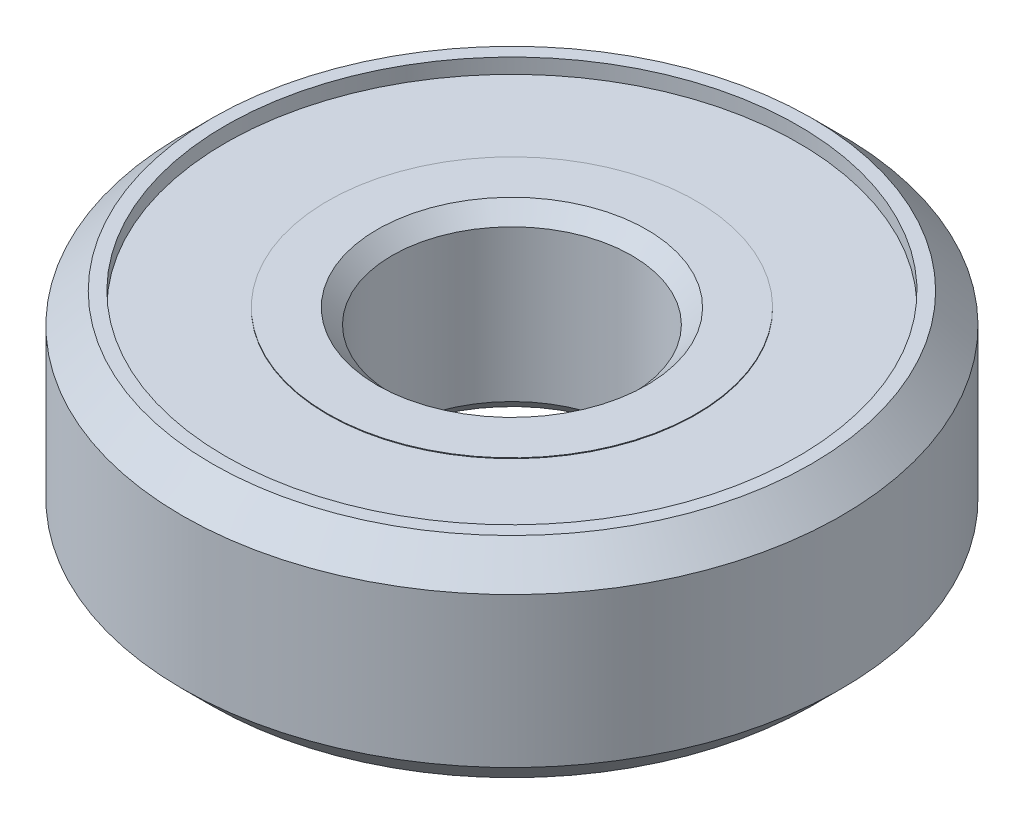
ISO-10303-21;
HEADER;
FILE_DESCRIPTION(('STEP AP214'),'2;1');
FILE_NAME('part.step','',(''),(''),'','','');
FILE_SCHEMA(('AUTOMOTIVE_DESIGN { 1 0 10303 214 1 1 1 1 }'));
ENDSEC;
DATA;
#1=APPLICATION_CONTEXT('core data for automotive mechanical design processes');
#2=APPLICATION_PROTOCOL_DEFINITION('international standard','automotive_design',2000,#1);
#3=PRODUCT_CONTEXT('',#1,'mechanical');
#4=PRODUCT('Part','Part','',(#3));
#5=PRODUCT_RELATED_PRODUCT_CATEGORY('part','',(#4));
#6=PRODUCT_DEFINITION_FORMATION('','',#4);
#7=PRODUCT_DEFINITION_CONTEXT('part definition',#1,'design');
#8=PRODUCT_DEFINITION('design','',#6,#7);
#9=PRODUCT_DEFINITION_SHAPE('','',#8);
#10=(LENGTH_UNIT() NAMED_UNIT(*) SI_UNIT(.MILLI.,.METRE.));
#11=(NAMED_UNIT(*) PLANE_ANGLE_UNIT() SI_UNIT($,.RADIAN.));
#12=(NAMED_UNIT(*) SI_UNIT($,.STERADIAN.) SOLID_ANGLE_UNIT());
#13=UNCERTAINTY_MEASURE_WITH_UNIT(LENGTH_MEASURE(1.E-05),#10,'distance_accuracy_value','');
#14=(GEOMETRIC_REPRESENTATION_CONTEXT(3) GLOBAL_UNCERTAINTY_ASSIGNED_CONTEXT((#13)) GLOBAL_UNIT_ASSIGNED_CONTEXT((#10,
#11,#12)) REPRESENTATION_CONTEXT('',''));
#15=CARTESIAN_POINT('',(0.,0.,0.));
#16=DIRECTION('',(0.,0.,1.));
#17=DIRECTION('',(1.,0.,0.));
#18=AXIS2_PLACEMENT_3D('',#15,#16,#17);
#19=CARTESIAN_POINT('',(0.,7.,0.));
#20=DIRECTION('',(0.,-1.,0.));
#21=DIRECTION('',(0.,0.,-1.));
#22=AXIS2_PLACEMENT_3D('',#19,#20,#21);
#23=CYLINDRICAL_SURFACE('',#22,4.);
#24=CARTESIAN_POINT('',(0.,0.975000224000002,0.));
#25=DIRECTION('',(0.,-1.,0.));
#26=DIRECTION('',(0.,0.,-1.));
#27=AXIS2_PLACEMENT_3D('',#24,#25,#26);
#28=CIRCLE('',#27,4.);
#29=CARTESIAN_POINT('',(0.,0.975000224000002,-4.));
#30=VERTEX_POINT('',#29);
#31=EDGE_CURVE('E10',#30,#30,#28,.T.);
#32=ORIENTED_EDGE('',*,*,#31,.T.);
#33=EDGE_LOOP('',(#32));
#34=FACE_BOUND('',#33,.T.);
#35=CARTESIAN_POINT('',(0.,6.02500000000001,0.));
#36=DIRECTION('',(0.,1.,0.));
#37=DIRECTION('',(0.,0.,1.));
#38=AXIS2_PLACEMENT_3D('',#35,#36,#37);
#39=CIRCLE('',#38,4.);
#40=CARTESIAN_POINT('',(0.,6.02500000000001,4.));
#41=VERTEX_POINT('',#40);
#42=EDGE_CURVE('E53',#41,#41,#39,.T.);
#43=ORIENTED_EDGE('',*,*,#42,.T.);
#44=EDGE_LOOP('',(#43));
#45=FACE_BOUND('',#44,.T.);
#46=ADVANCED_FACE('F33',(#34,#45),#23,.F.);
#47=CARTESIAN_POINT('',(0.,0.,0.));
#48=DIRECTION('',(0.,1.,0.));
#49=DIRECTION('',(0.,0.,1.));
#50=AXIS2_PLACEMENT_3D('',#47,#48,#49);
#51=PLANE('',#50);
#52=CARTESIAN_POINT('',(0.,0.,0.));
#53=DIRECTION('',(0.,1.,0.));
#54=DIRECTION('',(0.,0.,1.));
#55=AXIS2_PLACEMENT_3D('',#52,#53,#54);
#56=CIRCLE('',#55,10.);
#57=CARTESIAN_POINT('',(0.,0.,10.));
#58=VERTEX_POINT('',#57);
#59=EDGE_CURVE('E56',#58,#58,#56,.F.);
#60=ORIENTED_EDGE('',*,*,#59,.T.);
#61=EDGE_LOOP('',(#60));
#62=FACE_BOUND('',#61,.T.);
#63=CARTESIAN_POINT('',(0.,2.2399999910494E-07,0.));
#64=DIRECTION('',(0.,1.,0.));
#65=DIRECTION('',(0.,0.,1.));
#66=AXIS2_PLACEMENT_3D('',#63,#64,#65);
#67=CIRCLE('',#66,9.56049987692541);
#68=CARTESIAN_POINT('',(0.,2.2399999910494E-07,9.56049987692541));
#69=VERTEX_POINT('',#68);
#70=EDGE_CURVE('E81',#69,#69,#67,.T.);
#71=ORIENTED_EDGE('',*,*,#70,.T.);
#72=EDGE_LOOP('',(#71));
#73=FACE_BOUND('',#72,.T.);
#74=ADVANCED_FACE('F104',(#62,#73),#51,.F.);
#75=CARTESIAN_POINT('',(0.,6.5,0.));
#76=DIRECTION('',(0.,1.,0.));
#77=DIRECTION('',(0.,0.,1.));
#78=AXIS2_PLACEMENT_3D('',#75,#76,#77);
#79=PLANE('',#78);
#80=CARTESIAN_POINT('',(0.,6.5,0.));
#81=DIRECTION('',(0.,1.,0.));
#82=DIRECTION('',(0.,0.,1.));
#83=AXIS2_PLACEMENT_3D('',#80,#81,#82);
#84=CIRCLE('',#83,9.56049987692541);
#85=CARTESIAN_POINT('',(0.,6.5,9.56049987692541));
#86=VERTEX_POINT('',#85);
#87=EDGE_CURVE('E68',#86,#86,#84,.T.);
#88=ORIENTED_EDGE('',*,*,#87,.T.);
#89=EDGE_LOOP('',(#88));
#90=FACE_BOUND('',#89,.T.);
#91=CARTESIAN_POINT('',(0.,6.5,0.));
#92=DIRECTION('',(0.,1.,0.));
#93=DIRECTION('',(0.,0.,1.));
#94=AXIS2_PLACEMENT_3D('',#91,#92,#93);
#95=CIRCLE('',#94,6.15250093137121);
#96=CARTESIAN_POINT('',(0.,6.5,6.15250093137121));
#97=VERTEX_POINT('',#96);
#98=EDGE_CURVE('E75',#97,#97,#95,.T.);
#99=ORIENTED_EDGE('',*,*,#98,.F.);
#100=EDGE_LOOP('',(#99));
#101=FACE_BOUND('',#100,.T.);
#102=ADVANCED_FACE('F109',(#90,#101),#79,.T.);
#103=CARTESIAN_POINT('',(0.,7.,0.));
#104=DIRECTION('',(0.,1.,0.));
#105=DIRECTION('',(0.,0.,1.));
#106=AXIS2_PLACEMENT_3D('',#103,#104,#105);
#107=PLANE('',#106);
#108=CARTESIAN_POINT('',(0.,7.,0.));
#109=DIRECTION('',(0.,1.,0.));
#110=DIRECTION('',(0.,0.,1.));
#111=AXIS2_PLACEMENT_3D('',#108,#109,#110);
#112=CIRCLE('',#111,9.56049987692541);
#113=CARTESIAN_POINT('',(0.,7.,9.56049987692541));
#114=VERTEX_POINT('',#113);
#115=EDGE_CURVE('E69',#114,#114,#112,.T.);
#116=ORIENTED_EDGE('',*,*,#115,.F.);
#117=EDGE_LOOP('',(#116));
#118=FACE_BOUND('',#117,.T.);
#119=CARTESIAN_POINT('',(0.,7.,0.));
#120=DIRECTION('',(0.,1.,0.));
#121=DIRECTION('',(0.,0.,1.));
#122=AXIS2_PLACEMENT_3D('',#119,#120,#121);
#123=CIRCLE('',#122,10.);
#124=CARTESIAN_POINT('',(0.,7.,10.));
#125=VERTEX_POINT('',#124);
#126=EDGE_CURVE('E65',#125,#125,#123,.T.);
#127=ORIENTED_EDGE('',*,*,#126,.T.);
#128=EDGE_LOOP('',(#127));
#129=FACE_BOUND('',#128,.T.);
#130=ADVANCED_FACE('F117',(#118,#129),#107,.T.);
#131=CARTESIAN_POINT('',(0.,7.,0.));
#132=DIRECTION('',(0.,-1.,0.));
#133=DIRECTION('',(0.,0.,-1.));
#134=AXIS2_PLACEMENT_3D('',#131,#132,#133);
#135=CYLINDRICAL_SURFACE('',#134,11.);
#136=CARTESIAN_POINT('',(0.,6.00000000000001,0.));
#137=DIRECTION('',(0.,1.,0.));
#138=DIRECTION('',(0.,0.,1.));
#139=AXIS2_PLACEMENT_3D('',#136,#137,#138);
#140=CIRCLE('',#139,11.);
#141=CARTESIAN_POINT('',(0.,6.00000000000001,11.));
#142=VERTEX_POINT('',#141);
#143=EDGE_CURVE('E59',#142,#142,#140,.F.);
#144=ORIENTED_EDGE('',*,*,#143,.T.);
#145=EDGE_LOOP('',(#144));
#146=FACE_BOUND('',#145,.T.);
#147=CARTESIAN_POINT('',(0.,0.999999999999997,0.));
#148=DIRECTION('',(0.,1.,0.));
#149=DIRECTION('',(0.,0.,1.));
#150=AXIS2_PLACEMENT_3D('',#147,#148,#149);
#151=CIRCLE('',#150,11.);
#152=CARTESIAN_POINT('',(0.,0.999999999999997,11.));
#153=VERTEX_POINT('',#152);
#154=EDGE_CURVE('E62',#153,#153,#151,.T.);
#155=ORIENTED_EDGE('',*,*,#154,.T.);
#156=EDGE_LOOP('',(#155));
#157=FACE_BOUND('',#156,.T.);
#158=ADVANCED_FACE('F119',(#146,#157),#135,.T.);
#159=CARTESIAN_POINT('',(0.,7.,0.));
#160=DIRECTION('',(0.,-1.,0.));
#161=DIRECTION('',(0.,0.,-1.));
#162=AXIS2_PLACEMENT_3D('',#159,#160,#161);
#163=CONICAL_SURFACE('',#162,10.,0.785398163397448);
#164=ORIENTED_EDGE('',*,*,#143,.F.);
#165=EDGE_LOOP('',(#164));
#166=FACE_BOUND('',#165,.T.);
#167=ORIENTED_EDGE('',*,*,#126,.F.);
#168=EDGE_LOOP('',(#167));
#169=FACE_BOUND('',#168,.T.);
#170=ADVANCED_FACE('F124',(#166,#169),#163,.T.);
#171=CARTESIAN_POINT('',(0.,0.999999999999997,0.));
#172=DIRECTION('',(0.,1.,0.));
#173=DIRECTION('',(0.,0.,1.));
#174=AXIS2_PLACEMENT_3D('',#171,#172,#173);
#175=CONICAL_SURFACE('',#174,11.,0.785398163397451);
#176=ORIENTED_EDGE('',*,*,#59,.F.);
#177=EDGE_LOOP('',(#176));
#178=FACE_BOUND('',#177,.T.);
#179=ORIENTED_EDGE('',*,*,#154,.F.);
#180=EDGE_LOOP('',(#179));
#181=FACE_BOUND('',#180,.T.);
#182=ADVANCED_FACE('F128',(#178,#181),#175,.T.);
#183=CARTESIAN_POINT('',(0.,6.5,0.));
#184=DIRECTION('',(0.,1.,0.));
#185=DIRECTION('',(0.,0.,1.));
#186=AXIS2_PLACEMENT_3D('',#183,#184,#185);
#187=CYLINDRICAL_SURFACE('',#186,9.56049987692541);
#188=ORIENTED_EDGE('',*,*,#87,.F.);
#189=EDGE_LOOP('',(#188));
#190=FACE_BOUND('',#189,.T.);
#191=ORIENTED_EDGE('',*,*,#115,.T.);
#192=EDGE_LOOP('',(#191));
#193=FACE_BOUND('',#192,.T.);
#194=ADVANCED_FACE('F115',(#190,#193),#187,.F.);
#195=CARTESIAN_POINT('',(0.,6.525,0.));
#196=DIRECTION('',(0.,1.,0.));
#197=DIRECTION('',(0.,0.,1.));
#198=AXIS2_PLACEMENT_3D('',#195,#196,#197);
#199=PLANE('',#198);
#200=CARTESIAN_POINT('',(0.,6.525,0.));
#201=DIRECTION('',(0.,1.,0.));
#202=DIRECTION('',(0.,0.,1.));
#203=AXIS2_PLACEMENT_3D('',#200,#201,#202);
#204=CIRCLE('',#203,4.5);
#205=CARTESIAN_POINT('',(0.,6.525,4.5));
#206=VERTEX_POINT('',#205);
#207=EDGE_CURVE('E48',#206,#206,#204,.F.);
#208=ORIENTED_EDGE('',*,*,#207,.T.);
#209=EDGE_LOOP('',(#208));
#210=FACE_BOUND('',#209,.T.);
#211=CARTESIAN_POINT('',(0.,6.525,0.));
#212=DIRECTION('',(0.,1.,0.));
#213=DIRECTION('',(0.,0.,1.));
#214=AXIS2_PLACEMENT_3D('',#211,#212,#213);
#215=CIRCLE('',#214,6.15250093137121);
#216=CARTESIAN_POINT('',(0.,6.525,6.15250093137121));
#217=VERTEX_POINT('',#216);
#218=EDGE_CURVE('E72',#217,#217,#215,.T.);
#219=ORIENTED_EDGE('',*,*,#218,.T.);
#220=EDGE_LOOP('',(#219));
#221=FACE_BOUND('',#220,.T.);
#222=ADVANCED_FACE('F143',(#210,#221),#199,.T.);
#223=CARTESIAN_POINT('',(0.,6.525,0.));
#224=DIRECTION('',(0.,-1.,0.));
#225=DIRECTION('',(0.,0.,-1.));
#226=AXIS2_PLACEMENT_3D('',#223,#224,#225);
#227=CYLINDRICAL_SURFACE('',#226,6.15250093137121);
#228=ORIENTED_EDGE('',*,*,#218,.F.);
#229=EDGE_LOOP('',(#228));
#230=FACE_BOUND('',#229,.T.);
#231=ORIENTED_EDGE('',*,*,#98,.T.);
#232=EDGE_LOOP('',(#231));
#233=FACE_BOUND('',#232,.T.);
#234=ADVANCED_FACE('F135',(#230,#233),#227,.T.);
#235=CARTESIAN_POINT('',(0.,6.02500000000001,0.));
#236=DIRECTION('',(0.,1.,0.));
#237=DIRECTION('',(0.,0.,1.));
#238=AXIS2_PLACEMENT_3D('',#235,#236,#237);
#239=CONICAL_SURFACE('',#238,4.,0.785398163397452);
#240=ORIENTED_EDGE('',*,*,#207,.F.);
#241=EDGE_LOOP('',(#240));
#242=FACE_BOUND('',#241,.T.);
#243=ORIENTED_EDGE('',*,*,#42,.F.);
#244=EDGE_LOOP('',(#243));
#245=FACE_BOUND('',#244,.T.);
#246=ADVANCED_FACE('F132',(#242,#245),#239,.F.);
#247=CARTESIAN_POINT('',(0.,0.500000223999999,0.));
#248=DIRECTION('',(0.,-1.,0.));
#249=DIRECTION('',(0.,0.,-1.));
#250=AXIS2_PLACEMENT_3D('',#247,#248,#249);
#251=CYLINDRICAL_SURFACE('',#250,9.56049987692541);
#252=CARTESIAN_POINT('',(0.,0.500000223999999,0.));
#253=DIRECTION('',(0.,1.,0.));
#254=DIRECTION('',(0.,0.,1.));
#255=AXIS2_PLACEMENT_3D('',#252,#253,#254);
#256=CIRCLE('',#255,9.56049987692541);
#257=CARTESIAN_POINT('',(0.,0.500000223999999,9.56049987692541));
#258=VERTEX_POINT('',#257);
#259=EDGE_CURVE('E78',#258,#258,#256,.T.);
#260=ORIENTED_EDGE('',*,*,#259,.T.);
#261=EDGE_LOOP('',(#260));
#262=FACE_BOUND('',#261,.T.);
#263=ORIENTED_EDGE('',*,*,#70,.F.);
#264=EDGE_LOOP('',(#263));
#265=FACE_BOUND('',#264,.T.);
#266=ADVANCED_FACE('F134',(#262,#265),#251,.F.);
#267=CARTESIAN_POINT('',(0.,0.500000223999999,0.));
#268=DIRECTION('',(0.,-1.,0.));
#269=DIRECTION('',(0.,0.,1.));
#270=AXIS2_PLACEMENT_3D('',#267,#268,#269);
#271=PLANE('',#270);
#272=CARTESIAN_POINT('',(0.,0.500000223999999,0.));
#273=DIRECTION('',(0.,-1.,0.));
#274=DIRECTION('',(0.,0.,-1.));
#275=AXIS2_PLACEMENT_3D('',#272,#273,#274);
#276=CIRCLE('',#275,6.15250093137121);
#277=CARTESIAN_POINT('',(0.,0.500000223999999,-6.15250093137121));
#278=VERTEX_POINT('',#277);
#279=EDGE_CURVE('E44',#278,#278,#276,.T.);
#280=ORIENTED_EDGE('',*,*,#279,.F.);
#281=EDGE_LOOP('',(#280));
#282=FACE_BOUND('',#281,.T.);
#283=ORIENTED_EDGE('',*,*,#259,.F.);
#284=EDGE_LOOP('',(#283));
#285=FACE_BOUND('',#284,.T.);
#286=ADVANCED_FACE('F101',(#282,#285),#271,.T.);
#287=CARTESIAN_POINT('',(0.,0.475000223999999,0.));
#288=DIRECTION('',(0.,1.,0.));
#289=DIRECTION('',(0.,0.,1.));
#290=AXIS2_PLACEMENT_3D('',#287,#288,#289);
#291=CYLINDRICAL_SURFACE('',#290,6.15250093137121);
#292=CARTESIAN_POINT('',(0.,0.475000223999999,0.));
#293=DIRECTION('',(0.,1.,0.));
#294=DIRECTION('',(0.,0.,1.));
#295=AXIS2_PLACEMENT_3D('',#292,#293,#294);
#296=CIRCLE('',#295,6.15250093137121);
#297=CARTESIAN_POINT('',(0.,0.475000223999999,6.15250093137121));
#298=VERTEX_POINT('',#297);
#299=EDGE_CURVE('E84',#298,#298,#296,.T.);
#300=ORIENTED_EDGE('',*,*,#299,.T.);
#301=EDGE_LOOP('',(#300));
#302=FACE_BOUND('',#301,.T.);
#303=ORIENTED_EDGE('',*,*,#279,.T.);
#304=EDGE_LOOP('',(#303));
#305=FACE_BOUND('',#304,.T.);
#306=ADVANCED_FACE('F90',(#302,#305),#291,.T.);
#307=CARTESIAN_POINT('',(0.,0.475000223999999,0.));
#308=DIRECTION('',(0.,-1.,0.));
#309=DIRECTION('',(0.,0.,1.));
#310=AXIS2_PLACEMENT_3D('',#307,#308,#309);
#311=PLANE('',#310);
#312=CARTESIAN_POINT('',(0.,0.475000223999999,0.));
#313=DIRECTION('',(0.,-1.,0.));
#314=DIRECTION('',(0.,0.,-1.));
#315=AXIS2_PLACEMENT_3D('',#312,#313,#314);
#316=CIRCLE('',#315,4.50000000000001);
#317=CARTESIAN_POINT('',(0.,0.475000223999999,-4.50000000000001));
#318=VERTEX_POINT('',#317);
#319=EDGE_CURVE('E40',#318,#318,#316,.F.);
#320=ORIENTED_EDGE('',*,*,#319,.T.);
#321=EDGE_LOOP('',(#320));
#322=FACE_BOUND('',#321,.T.);
#323=ORIENTED_EDGE('',*,*,#299,.F.);
#324=EDGE_LOOP('',(#323));
#325=FACE_BOUND('',#324,.T.);
#326=ADVANCED_FACE('F93',(#322,#325),#311,.T.);
#327=CARTESIAN_POINT('',(0.,0.475000223999999,0.));
#328=DIRECTION('',(0.,-1.,0.));
#329=DIRECTION('',(0.,0.,-1.));
#330=AXIS2_PLACEMENT_3D('',#327,#328,#329);
#331=CONICAL_SURFACE('',#330,4.50000000000001,0.785398163397454);
#332=ORIENTED_EDGE('',*,*,#31,.F.);
#333=EDGE_LOOP('',(#332));
#334=FACE_BOUND('',#333,.T.);
#335=ORIENTED_EDGE('',*,*,#319,.F.);
#336=EDGE_LOOP('',(#335));
#337=FACE_BOUND('',#336,.T.);
#338=ADVANCED_FACE('F35',(#334,#337),#331,.F.);
#339=CLOSED_SHELL('',(#46,#74,#102,#130,#158,#170,#182,#194,#222,#234,#246,#266,#286,#306,#326,#338));
#340=MANIFOLD_SOLID_BREP('B2',#339);
#341=ADVANCED_BREP_SHAPE_REPRESENTATION('',(#18,#340),#14);
#342=SHAPE_DEFINITION_REPRESENTATION(#9,#341);
ENDSEC;
END-ISO-10303-21;
